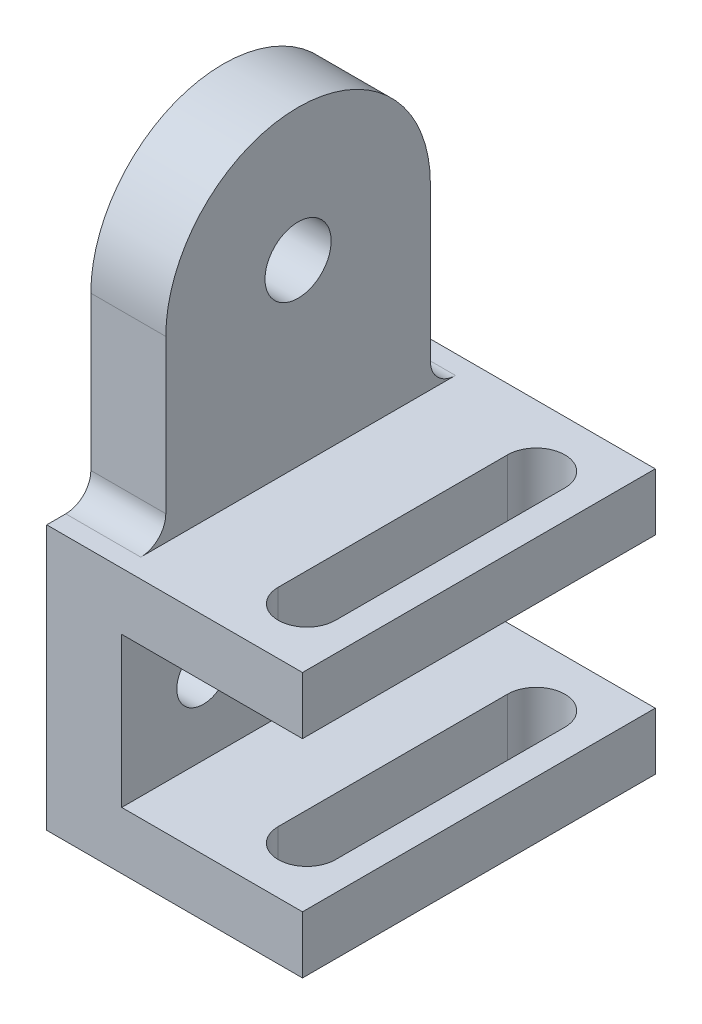
ISO-10303-21;
HEADER;
FILE_DESCRIPTION(('STEP AP214'),'2;1');
FILE_NAME('part.step','',(''),(''),'','','');
FILE_SCHEMA(('AUTOMOTIVE_DESIGN { 1 0 10303 214 1 1 1 1 }'));
ENDSEC;
DATA;
#1=APPLICATION_CONTEXT('core data for automotive mechanical design processes');
#2=APPLICATION_PROTOCOL_DEFINITION('international standard','automotive_design',2000,#1);
#3=PRODUCT_CONTEXT('',#1,'mechanical');
#4=PRODUCT('Part','Part','',(#3));
#5=PRODUCT_RELATED_PRODUCT_CATEGORY('part','',(#4));
#6=PRODUCT_DEFINITION_FORMATION('','',#4);
#7=PRODUCT_DEFINITION_CONTEXT('part definition',#1,'design');
#8=PRODUCT_DEFINITION('design','',#6,#7);
#9=PRODUCT_DEFINITION_SHAPE('','',#8);
#10=(LENGTH_UNIT() NAMED_UNIT(*) SI_UNIT(.MILLI.,.METRE.));
#11=(NAMED_UNIT(*) PLANE_ANGLE_UNIT() SI_UNIT($,.RADIAN.));
#12=(NAMED_UNIT(*) SI_UNIT($,.STERADIAN.) SOLID_ANGLE_UNIT());
#13=UNCERTAINTY_MEASURE_WITH_UNIT(LENGTH_MEASURE(1.E-05),#10,'distance_accuracy_value','');
#14=(GEOMETRIC_REPRESENTATION_CONTEXT(3) GLOBAL_UNCERTAINTY_ASSIGNED_CONTEXT((#13)) GLOBAL_UNIT_ASSIGNED_CONTEXT((#10,
#11,#12)) REPRESENTATION_CONTEXT('',''));
#15=CARTESIAN_POINT('',(0.,0.,0.));
#16=DIRECTION('',(0.,0.,1.));
#17=DIRECTION('',(1.,0.,0.));
#18=AXIS2_PLACEMENT_3D('',#15,#16,#17);
#19=CARTESIAN_POINT('',(29.,-17.,-80.));
#20=DIRECTION('',(1.,0.,0.));
#21=DIRECTION('',(0.,0.,-1.));
#22=AXIS2_PLACEMENT_3D('',#19,#20,#21);
#23=PLANE('',#22);
#24=DIRECTION('',(0.,1.,0.));
#25=VECTOR('',#24,1.);
#26=CARTESIAN_POINT('',(29.,-17.,0.));
#27=LINE('',#26,#25);
#28=CARTESIAN_POINT('',(29.,-30.,0.));
#29=VERTEX_POINT('',#28);
#30=CARTESIAN_POINT('',(29.,-17.,0.));
#31=VERTEX_POINT('',#30);
#32=EDGE_CURVE('E311',#29,#31,#27,.T.);
#33=ORIENTED_EDGE('',*,*,#32,.F.);
#34=DIRECTION('',(0.,0.,1.));
#35=VECTOR('',#34,1.);
#36=CARTESIAN_POINT('',(29.,-30.,-80.));
#37=LINE('',#36,#35);
#38=CARTESIAN_POINT('',(29.,-30.,-80.));
#39=VERTEX_POINT('',#38);
#40=EDGE_CURVE('E391',#39,#29,#37,.T.);
#41=ORIENTED_EDGE('',*,*,#40,.F.);
#42=DIRECTION('',(0.,1.,0.));
#43=VECTOR('',#42,1.);
#44=CARTESIAN_POINT('',(29.,-17.,-80.));
#45=LINE('',#44,#43);
#46=CARTESIAN_POINT('',(29.,-17.,-80.));
#47=VERTEX_POINT('',#46);
#48=EDGE_CURVE('E327',#39,#47,#45,.T.);
#49=ORIENTED_EDGE('',*,*,#48,.T.);
#50=DIRECTION('',(0.,0.,1.));
#51=VECTOR('',#50,1.);
#52=CARTESIAN_POINT('',(29.,-17.,-80.));
#53=LINE('',#52,#51);
#54=EDGE_CURVE('E360',#47,#31,#53,.T.);
#55=ORIENTED_EDGE('',*,*,#54,.T.);
#56=EDGE_LOOP('',(#33,#41,#49,#55));
#57=FACE_BOUND('',#56,.T.);
#58=ADVANCED_FACE('F43',(#57),#23,.T.);
#59=CARTESIAN_POINT('',(-29.,-30.,-80.));
#60=DIRECTION('',(0.,-1.,0.));
#61=DIRECTION('',(0.,0.,-1.));
#62=AXIS2_PLACEMENT_3D('',#59,#60,#61);
#63=PLANE('',#62);
#64=CARTESIAN_POINT('',(16.,-30.,-66.));
#65=DIRECTION('',(0.,-1.,0.));
#66=DIRECTION('',(0.,0.,-1.));
#67=AXIS2_PLACEMENT_3D('',#64,#65,#66);
#68=CIRCLE('',#67,6.5);
#69=CARTESIAN_POINT('',(9.49999999999999,-30.,-66.));
#70=VERTEX_POINT('',#69);
#71=CARTESIAN_POINT('',(22.5,-30.,-66.));
#72=VERTEX_POINT('',#71);
#73=EDGE_CURVE('E254',#70,#72,#68,.T.);
#74=ORIENTED_EDGE('',*,*,#73,.F.);
#75=DIRECTION('',(0.,0.,-1.));
#76=VECTOR('',#75,1.);
#77=CARTESIAN_POINT('',(9.49999999999999,-30.,-80.));
#78=LINE('',#77,#76);
#79=CARTESIAN_POINT('',(9.5,-30.,-14.));
#80=VERTEX_POINT('',#79);
#81=EDGE_CURVE('E237',#80,#70,#78,.T.);
#82=ORIENTED_EDGE('',*,*,#81,.F.);
#83=CARTESIAN_POINT('',(16.,-30.,-14.));
#84=DIRECTION('',(0.,-1.,0.));
#85=DIRECTION('',(0.,0.,-1.));
#86=AXIS2_PLACEMENT_3D('',#83,#84,#85);
#87=CIRCLE('',#86,6.5);
#88=CARTESIAN_POINT('',(22.5,-30.,-14.));
#89=VERTEX_POINT('',#88);
#90=EDGE_CURVE('E242',#89,#80,#87,.T.);
#91=ORIENTED_EDGE('',*,*,#90,.F.);
#92=DIRECTION('',(0.,0.,1.));
#93=VECTOR('',#92,1.);
#94=CARTESIAN_POINT('',(22.5,-30.,-80.));
#95=LINE('',#94,#93);
#96=EDGE_CURVE('E248',#72,#89,#95,.T.);
#97=ORIENTED_EDGE('',*,*,#96,.F.);
#98=EDGE_LOOP('',(#74,#82,#91,#97));
#99=FACE_BOUND('',#98,.T.);
#100=DIRECTION('',(1.,0.,0.));
#101=VECTOR('',#100,1.);
#102=CARTESIAN_POINT('',(-29.,-30.,0.));
#103=LINE('',#102,#101);
#104=CARTESIAN_POINT('',(-29.,-30.,0.));
#105=VERTEX_POINT('',#104);
#106=EDGE_CURVE('E332',#105,#29,#103,.T.);
#107=ORIENTED_EDGE('',*,*,#106,.F.);
#108=DIRECTION('',(0.,0.,1.));
#109=VECTOR('',#108,1.);
#110=CARTESIAN_POINT('',(-29.,-30.,-80.));
#111=LINE('',#110,#109);
#112=CARTESIAN_POINT('',(-29.,-30.,-80.));
#113=VERTEX_POINT('',#112);
#114=EDGE_CURVE('E395',#113,#105,#111,.T.);
#115=ORIENTED_EDGE('',*,*,#114,.F.);
#116=DIRECTION('',(1.,0.,0.));
#117=VECTOR('',#116,1.);
#118=CARTESIAN_POINT('',(-29.,-30.,-80.));
#119=LINE('',#118,#117);
#120=EDGE_CURVE('E356',#113,#39,#119,.T.);
#121=ORIENTED_EDGE('',*,*,#120,.T.);
#122=ORIENTED_EDGE('',*,*,#40,.T.);
#123=EDGE_LOOP('',(#107,#115,#121,#122));
#124=FACE_BOUND('',#123,.T.);
#125=ADVANCED_FACE('F506',(#99,#124),#63,.T.);
#126=CARTESIAN_POINT('',(-29.,30.,-80.));
#127=DIRECTION('',(-1.,0.,0.));
#128=DIRECTION('',(0.,-1.,0.));
#129=AXIS2_PLACEMENT_3D('',#126,#127,#128);
#130=PLANE('',#129);
#131=CARTESIAN_POINT('',(-29.,0.,-18.5));
#132=DIRECTION('',(-1.,0.,0.));
#133=DIRECTION('',(0.,-1.,0.));
#134=AXIS2_PLACEMENT_3D('',#131,#132,#133);
#135=CIRCLE('',#134,6.);
#136=CARTESIAN_POINT('',(-29.,-6.,-18.5));
#137=VERTEX_POINT('',#136);
#138=EDGE_CURVE('E790',#137,#137,#135,.T.);
#139=ORIENTED_EDGE('',*,*,#138,.F.);
#140=EDGE_LOOP('',(#139));
#141=FACE_BOUND('',#140,.T.);
#142=CARTESIAN_POINT('',(-29.,0.,-61.5));
#143=DIRECTION('',(-1.,0.,0.));
#144=DIRECTION('',(0.,-1.,0.));
#145=AXIS2_PLACEMENT_3D('',#142,#143,#144);
#146=CIRCLE('',#145,6.);
#147=CARTESIAN_POINT('',(-29.,-6.00000000000001,-61.5));
#148=VERTEX_POINT('',#147);
#149=EDGE_CURVE('E795',#148,#148,#146,.T.);
#150=ORIENTED_EDGE('',*,*,#149,.F.);
#151=EDGE_LOOP('',(#150));
#152=FACE_BOUND('',#151,.T.);
#153=CARTESIAN_POINT('',(-29.,70.5,-40.));
#154=DIRECTION('',(-1.,0.,0.));
#155=DIRECTION('',(0.,-1.,0.));
#156=AXIS2_PLACEMENT_3D('',#153,#154,#155);
#157=CIRCLE('',#156,7.5);
#158=CARTESIAN_POINT('',(-29.,63.,-40.));
#159=VERTEX_POINT('',#158);
#160=EDGE_CURVE('E257',#159,#159,#157,.T.);
#161=ORIENTED_EDGE('',*,*,#160,.F.);
#162=EDGE_LOOP('',(#161));
#163=FACE_BOUND('',#162,.T.);
#164=DIRECTION('',(0.,-1.,0.));
#165=VECTOR('',#164,1.);
#166=CARTESIAN_POINT('',(-29.,30.,0.));
#167=LINE('',#166,#165);
#168=CARTESIAN_POINT('',(-29.,30.,0.));
#169=VERTEX_POINT('',#168);
#170=EDGE_CURVE('E384',#169,#105,#167,.T.);
#171=ORIENTED_EDGE('',*,*,#170,.F.);
#172=DIRECTION('',(0.,0.,1.));
#173=VECTOR('',#172,1.);
#174=CARTESIAN_POINT('',(-29.,30.,-80.));
#175=LINE('',#174,#173);
#176=CARTESIAN_POINT('',(-29.,30.,-4.31606843045706));
#177=VERTEX_POINT('',#176);
#178=EDGE_CURVE('E401',#177,#169,#175,.T.);
#179=ORIENTED_EDGE('',*,*,#178,.F.);
#180=CARTESIAN_POINT('',(-29.,35.6839315695429,-4.31606843045711));
#181=DIRECTION('',(1.,0.,0.));
#182=DIRECTION('',(0.,1.,0.));
#183=AXIS2_PLACEMENT_3D('',#180,#181,#182);
#184=CIRCLE('',#183,5.68393156954289);
#185=CARTESIAN_POINT('',(-29.,35.6839315695429,-10.));
#186=VERTEX_POINT('',#185);
#187=EDGE_CURVE('E262',#177,#186,#184,.T.);
#188=ORIENTED_EDGE('',*,*,#187,.T.);
#189=DIRECTION('',(0.,-1.,0.));
#190=VECTOR('',#189,1.);
#191=CARTESIAN_POINT('',(-29.,70.5,-10.));
#192=LINE('',#191,#190);
#193=CARTESIAN_POINT('',(-29.,70.5,-10.));
#194=VERTEX_POINT('',#193);
#195=EDGE_CURVE('E292',#194,#186,#192,.T.);
#196=ORIENTED_EDGE('',*,*,#195,.F.);
#197=CARTESIAN_POINT('',(-29.,70.5,-40.));
#198=DIRECTION('',(-1.,0.,0.));
#199=DIRECTION('',(0.,-1.,0.));
#200=AXIS2_PLACEMENT_3D('',#197,#198,#199);
#201=CIRCLE('',#200,30.);
#202=CARTESIAN_POINT('',(-29.,70.5,-70.));
#203=VERTEX_POINT('',#202);
#204=EDGE_CURVE('E296',#194,#203,#201,.T.);
#205=ORIENTED_EDGE('',*,*,#204,.T.);
#206=DIRECTION('',(0.,-1.,0.));
#207=VECTOR('',#206,1.);
#208=CARTESIAN_POINT('',(-29.,70.5,-70.));
#209=LINE('',#208,#207);
#210=CARTESIAN_POINT('',(-29.,35.6839315695429,-70.));
#211=VERTEX_POINT('',#210);
#212=EDGE_CURVE('E300',#203,#211,#209,.T.);
#213=ORIENTED_EDGE('',*,*,#212,.T.);
#214=CARTESIAN_POINT('',(-29.,35.6839315695429,-75.6839315695429));
#215=DIRECTION('',(-1.,0.,0.));
#216=DIRECTION('',(0.,-1.,0.));
#217=AXIS2_PLACEMENT_3D('',#214,#215,#216);
#218=CIRCLE('',#217,5.68393156954289);
#219=CARTESIAN_POINT('',(-29.,30.,-75.6839315695429));
#220=VERTEX_POINT('',#219);
#221=EDGE_CURVE('E271',#220,#211,#218,.T.);
#222=ORIENTED_EDGE('',*,*,#221,.F.);
#223=CARTESIAN_POINT('',(-29.,30.,-80.));
#224=VERTEX_POINT('',#223);
#225=EDGE_CURVE('E398',#224,#220,#175,.T.);
#226=ORIENTED_EDGE('',*,*,#225,.F.);
#227=DIRECTION('',(0.,-1.,0.));
#228=VECTOR('',#227,1.);
#229=CARTESIAN_POINT('',(-29.,30.,-80.));
#230=LINE('',#229,#228);
#231=EDGE_CURVE('E352',#224,#113,#230,.T.);
#232=ORIENTED_EDGE('',*,*,#231,.T.);
#233=ORIENTED_EDGE('',*,*,#114,.T.);
#234=EDGE_LOOP('',(#171,#179,#188,#196,#205,#213,#222,#226,#232,#233));
#235=FACE_BOUND('',#234,.T.);
#236=ADVANCED_FACE('F454',(#141,#152,#163,#235),#130,.T.);
#237=CARTESIAN_POINT('',(-29.,30.,-80.));
#238=DIRECTION('',(0.,1.,0.));
#239=DIRECTION('',(0.,0.,1.));
#240=AXIS2_PLACEMENT_3D('',#237,#238,#239);
#241=PLANE('',#240);
#242=CARTESIAN_POINT('',(16.,30.,-66.));
#243=DIRECTION('',(0.,1.,0.));
#244=DIRECTION('',(0.,0.,1.));
#245=AXIS2_PLACEMENT_3D('',#242,#243,#244);
#246=CIRCLE('',#245,6.5);
#247=CARTESIAN_POINT('',(22.5,30.,-66.));
#248=VERTEX_POINT('',#247);
#249=CARTESIAN_POINT('',(9.5,30.,-66.));
#250=VERTEX_POINT('',#249);
#251=EDGE_CURVE('E66',#248,#250,#246,.T.);
#252=ORIENTED_EDGE('',*,*,#251,.F.);
#253=DIRECTION('',(0.,0.,-1.));
#254=VECTOR('',#253,1.);
#255=CARTESIAN_POINT('',(22.5,30.,-66.));
#256=LINE('',#255,#254);
#257=CARTESIAN_POINT('',(22.5,30.,-14.));
#258=VERTEX_POINT('',#257);
#259=EDGE_CURVE('E217',#258,#248,#256,.T.);
#260=ORIENTED_EDGE('',*,*,#259,.F.);
#261=CARTESIAN_POINT('',(16.,30.,-14.));
#262=DIRECTION('',(0.,1.,0.));
#263=DIRECTION('',(0.,0.,1.));
#264=AXIS2_PLACEMENT_3D('',#261,#262,#263);
#265=CIRCLE('',#264,6.5);
#266=CARTESIAN_POINT('',(9.5,30.,-14.));
#267=VERTEX_POINT('',#266);
#268=EDGE_CURVE('E198',#267,#258,#265,.T.);
#269=ORIENTED_EDGE('',*,*,#268,.F.);
#270=DIRECTION('',(0.,0.,1.));
#271=VECTOR('',#270,1.);
#272=CARTESIAN_POINT('',(9.49999999999999,30.,-66.));
#273=LINE('',#272,#271);
#274=EDGE_CURVE('E208',#250,#267,#273,.T.);
#275=ORIENTED_EDGE('',*,*,#274,.F.);
#276=EDGE_LOOP('',(#252,#260,#269,#275));
#277=FACE_BOUND('',#276,.T.);
#278=DIRECTION('',(-1.,0.,0.));
#279=VECTOR('',#278,1.);
#280=CARTESIAN_POINT('',(-12.,30.,-4.31606843045706));
#281=LINE('',#280,#279);
#282=CARTESIAN_POINT('',(-12.,30.,-4.31606843045707));
#283=VERTEX_POINT('',#282);
#284=EDGE_CURVE('E307',#283,#177,#281,.T.);
#285=ORIENTED_EDGE('',*,*,#284,.T.);
#286=ORIENTED_EDGE('',*,*,#178,.T.);
#287=DIRECTION('',(-1.,0.,0.));
#288=VECTOR('',#287,1.);
#289=CARTESIAN_POINT('',(-29.,30.,0.));
#290=LINE('',#289,#288);
#291=CARTESIAN_POINT('',(29.,30.,0.));
#292=VERTEX_POINT('',#291);
#293=EDGE_CURVE('E380',#292,#169,#290,.T.);
#294=ORIENTED_EDGE('',*,*,#293,.F.);
#295=DIRECTION('',(0.,0.,1.));
#296=VECTOR('',#295,1.);
#297=CARTESIAN_POINT('',(29.,30.,-80.));
#298=LINE('',#297,#296);
#299=CARTESIAN_POINT('',(29.,30.,-80.));
#300=VERTEX_POINT('',#299);
#301=EDGE_CURVE('E402',#300,#292,#298,.T.);
#302=ORIENTED_EDGE('',*,*,#301,.F.);
#303=DIRECTION('',(-1.,0.,0.));
#304=VECTOR('',#303,1.);
#305=CARTESIAN_POINT('',(-29.,30.,-80.));
#306=LINE('',#305,#304);
#307=EDGE_CURVE('E348',#300,#224,#306,.T.);
#308=ORIENTED_EDGE('',*,*,#307,.T.);
#309=ORIENTED_EDGE('',*,*,#225,.T.);
#310=DIRECTION('',(-1.,0.,0.));
#311=VECTOR('',#310,1.);
#312=CARTESIAN_POINT('',(-12.,30.,-75.6839315695429));
#313=LINE('',#312,#311);
#314=CARTESIAN_POINT('',(-12.,30.,-75.6839315695429));
#315=VERTEX_POINT('',#314);
#316=EDGE_CURVE('E312',#315,#220,#313,.T.);
#317=ORIENTED_EDGE('',*,*,#316,.F.);
#318=DIRECTION('',(0.,0.,1.));
#319=VECTOR('',#318,1.);
#320=CARTESIAN_POINT('',(-12.,30.,-75.6839315695429));
#321=LINE('',#320,#319);
#322=EDGE_CURVE('E285',#315,#283,#321,.T.);
#323=ORIENTED_EDGE('',*,*,#322,.T.);
#324=EDGE_LOOP('',(#285,#286,#294,#302,#308,#309,#317,#323));
#325=FACE_BOUND('',#324,.T.);
#326=ADVANCED_FACE('F214',(#277,#325),#241,.T.);
#327=CARTESIAN_POINT('',(29.,30.,-80.));
#328=DIRECTION('',(1.,0.,0.));
#329=DIRECTION('',(0.,1.,0.));
#330=AXIS2_PLACEMENT_3D('',#327,#328,#329);
#331=PLANE('',#330);
#332=DIRECTION('',(0.,1.,0.));
#333=VECTOR('',#332,1.);
#334=CARTESIAN_POINT('',(29.,30.,0.));
#335=LINE('',#334,#333);
#336=CARTESIAN_POINT('',(29.,17.,0.));
#337=VERTEX_POINT('',#336);
#338=EDGE_CURVE('E376',#337,#292,#335,.T.);
#339=ORIENTED_EDGE('',*,*,#338,.F.);
#340=DIRECTION('',(0.,0.,1.));
#341=VECTOR('',#340,1.);
#342=CARTESIAN_POINT('',(29.,17.,-80.));
#343=LINE('',#342,#341);
#344=CARTESIAN_POINT('',(29.,17.,-80.));
#345=VERTEX_POINT('',#344);
#346=EDGE_CURVE('E405',#345,#337,#343,.T.);
#347=ORIENTED_EDGE('',*,*,#346,.F.);
#348=DIRECTION('',(0.,1.,0.));
#349=VECTOR('',#348,1.);
#350=CARTESIAN_POINT('',(29.,30.,-80.));
#351=LINE('',#350,#349);
#352=EDGE_CURVE('E344',#345,#300,#351,.T.);
#353=ORIENTED_EDGE('',*,*,#352,.T.);
#354=ORIENTED_EDGE('',*,*,#301,.T.);
#355=EDGE_LOOP('',(#339,#347,#353,#354));
#356=FACE_BOUND('',#355,.T.);
#357=ADVANCED_FACE('F461',(#356),#331,.T.);
#358=CARTESIAN_POINT('',(-12.,17.,-80.));
#359=DIRECTION('',(0.,-1.,0.));
#360=DIRECTION('',(0.,0.,-1.));
#361=AXIS2_PLACEMENT_3D('',#358,#359,#360);
#362=PLANE('',#361);
#363=CARTESIAN_POINT('',(16.,17.,-66.));
#364=DIRECTION('',(0.,-1.,0.));
#365=DIRECTION('',(0.,0.,-1.));
#366=AXIS2_PLACEMENT_3D('',#363,#364,#365);
#367=CIRCLE('',#366,6.5);
#368=CARTESIAN_POINT('',(9.49999999999999,17.,-66.));
#369=VERTEX_POINT('',#368);
#370=CARTESIAN_POINT('',(22.5,17.,-66.));
#371=VERTEX_POINT('',#370);
#372=EDGE_CURVE('E251',#369,#371,#367,.T.);
#373=ORIENTED_EDGE('',*,*,#372,.F.);
#374=DIRECTION('',(0.,0.,-1.));
#375=VECTOR('',#374,1.);
#376=CARTESIAN_POINT('',(9.49999999999999,17.,-80.));
#377=LINE('',#376,#375);
#378=CARTESIAN_POINT('',(9.5,17.,-14.));
#379=VERTEX_POINT('',#378);
#380=EDGE_CURVE('E234',#379,#369,#377,.T.);
#381=ORIENTED_EDGE('',*,*,#380,.F.);
#382=CARTESIAN_POINT('',(16.,17.,-14.));
#383=DIRECTION('',(0.,-1.,0.));
#384=DIRECTION('',(0.,0.,-1.));
#385=AXIS2_PLACEMENT_3D('',#382,#383,#384);
#386=CIRCLE('',#385,6.5);
#387=CARTESIAN_POINT('',(22.5,17.,-14.));
#388=VERTEX_POINT('',#387);
#389=EDGE_CURVE('E201',#388,#379,#386,.T.);
#390=ORIENTED_EDGE('',*,*,#389,.F.);
#391=DIRECTION('',(0.,0.,1.));
#392=VECTOR('',#391,1.);
#393=CARTESIAN_POINT('',(22.5,17.,-80.));
#394=LINE('',#393,#392);
#395=EDGE_CURVE('E245',#371,#388,#394,.T.);
#396=ORIENTED_EDGE('',*,*,#395,.F.);
#397=EDGE_LOOP('',(#373,#381,#390,#396));
#398=FACE_BOUND('',#397,.T.);
#399=DIRECTION('',(1.,0.,0.));
#400=VECTOR('',#399,1.);
#401=CARTESIAN_POINT('',(-12.,17.,0.));
#402=LINE('',#401,#400);
#403=CARTESIAN_POINT('',(-12.,17.,0.));
#404=VERTEX_POINT('',#403);
#405=EDGE_CURVE('E372',#404,#337,#402,.T.);
#406=ORIENTED_EDGE('',*,*,#405,.F.);
#407=DIRECTION('',(0.,0.,1.));
#408=VECTOR('',#407,1.);
#409=CARTESIAN_POINT('',(-12.,17.,-80.));
#410=LINE('',#409,#408);
#411=CARTESIAN_POINT('',(-12.,17.,-80.));
#412=VERTEX_POINT('',#411);
#413=EDGE_CURVE('E408',#412,#404,#410,.T.);
#414=ORIENTED_EDGE('',*,*,#413,.F.);
#415=DIRECTION('',(1.,0.,0.));
#416=VECTOR('',#415,1.);
#417=CARTESIAN_POINT('',(-12.,17.,-80.));
#418=LINE('',#417,#416);
#419=EDGE_CURVE('E340',#412,#345,#418,.T.);
#420=ORIENTED_EDGE('',*,*,#419,.T.);
#421=ORIENTED_EDGE('',*,*,#346,.T.);
#422=EDGE_LOOP('',(#406,#414,#420,#421));
#423=FACE_BOUND('',#422,.T.);
#424=ADVANCED_FACE('F522',(#398,#423),#362,.T.);
#425=CARTESIAN_POINT('',(-12.,17.,-80.));
#426=DIRECTION('',(1.,0.,0.));
#427=DIRECTION('',(0.,1.,0.));
#428=AXIS2_PLACEMENT_3D('',#425,#426,#427);
#429=PLANE('',#428);
#430=CARTESIAN_POINT('',(-12.,0.,-18.5));
#431=DIRECTION('',(1.,0.,0.));
#432=DIRECTION('',(0.,1.,0.));
#433=AXIS2_PLACEMENT_3D('',#430,#431,#432);
#434=CIRCLE('',#433,6.);
#435=CARTESIAN_POINT('',(-12.,6.,-18.5));
#436=VERTEX_POINT('',#435);
#437=EDGE_CURVE('E793',#436,#436,#434,.T.);
#438=ORIENTED_EDGE('',*,*,#437,.F.);
#439=EDGE_LOOP('',(#438));
#440=FACE_BOUND('',#439,.T.);
#441=CARTESIAN_POINT('',(-12.,0.,-61.5));
#442=DIRECTION('',(1.,0.,0.));
#443=DIRECTION('',(0.,1.,0.));
#444=AXIS2_PLACEMENT_3D('',#441,#442,#443);
#445=CIRCLE('',#444,6.);
#446=CARTESIAN_POINT('',(-12.,6.,-61.5));
#447=VERTEX_POINT('',#446);
#448=EDGE_CURVE('E796',#447,#447,#445,.T.);
#449=ORIENTED_EDGE('',*,*,#448,.F.);
#450=EDGE_LOOP('',(#449));
#451=FACE_BOUND('',#450,.T.);
#452=DIRECTION('',(0.,1.,0.));
#453=VECTOR('',#452,1.);
#454=CARTESIAN_POINT('',(-12.,17.,0.));
#455=LINE('',#454,#453);
#456=CARTESIAN_POINT('',(-12.,-17.,0.));
#457=VERTEX_POINT('',#456);
#458=EDGE_CURVE('E368',#457,#404,#455,.T.);
#459=ORIENTED_EDGE('',*,*,#458,.F.);
#460=DIRECTION('',(0.,0.,1.));
#461=VECTOR('',#460,1.);
#462=CARTESIAN_POINT('',(-12.,-17.,-80.));
#463=LINE('',#462,#461);
#464=CARTESIAN_POINT('',(-12.,-17.,-80.));
#465=VERTEX_POINT('',#464);
#466=EDGE_CURVE('E411',#465,#457,#463,.T.);
#467=ORIENTED_EDGE('',*,*,#466,.F.);
#468=DIRECTION('',(0.,1.,0.));
#469=VECTOR('',#468,1.);
#470=CARTESIAN_POINT('',(-12.,17.,-80.));
#471=LINE('',#470,#469);
#472=EDGE_CURVE('E336',#465,#412,#471,.T.);
#473=ORIENTED_EDGE('',*,*,#472,.T.);
#474=ORIENTED_EDGE('',*,*,#413,.T.);
#475=EDGE_LOOP('',(#459,#467,#473,#474));
#476=FACE_BOUND('',#475,.T.);
#477=ADVANCED_FACE('F520',(#440,#451,#476),#429,.T.);
#478=CARTESIAN_POINT('',(-12.,-17.,-80.));
#479=DIRECTION('',(0.,1.,0.));
#480=DIRECTION('',(0.,0.,1.));
#481=AXIS2_PLACEMENT_3D('',#478,#479,#480);
#482=PLANE('',#481);
#483=CARTESIAN_POINT('',(16.,-17.,-66.));
#484=DIRECTION('',(0.,1.,0.));
#485=DIRECTION('',(0.,0.,1.));
#486=AXIS2_PLACEMENT_3D('',#483,#484,#485);
#487=CIRCLE('',#486,6.5);
#488=CARTESIAN_POINT('',(22.5,-17.,-66.));
#489=VERTEX_POINT('',#488);
#490=CARTESIAN_POINT('',(9.49999999999999,-17.,-66.));
#491=VERTEX_POINT('',#490);
#492=EDGE_CURVE('E11',#489,#491,#487,.T.);
#493=ORIENTED_EDGE('',*,*,#492,.F.);
#494=DIRECTION('',(0.,0.,-1.));
#495=VECTOR('',#494,1.);
#496=CARTESIAN_POINT('',(22.5,-17.,-80.));
#497=LINE('',#496,#495);
#498=CARTESIAN_POINT('',(22.5,-17.,-14.));
#499=VERTEX_POINT('',#498);
#500=EDGE_CURVE('E51',#499,#489,#497,.T.);
#501=ORIENTED_EDGE('',*,*,#500,.F.);
#502=CARTESIAN_POINT('',(16.,-17.,-14.));
#503=DIRECTION('',(0.,1.,0.));
#504=DIRECTION('',(0.,0.,1.));
#505=AXIS2_PLACEMENT_3D('',#502,#503,#504);
#506=CIRCLE('',#505,6.5);
#507=CARTESIAN_POINT('',(9.5,-17.,-14.));
#508=VERTEX_POINT('',#507);
#509=EDGE_CURVE('E418',#508,#499,#506,.T.);
#510=ORIENTED_EDGE('',*,*,#509,.F.);
#511=DIRECTION('',(0.,0.,1.));
#512=VECTOR('',#511,1.);
#513=CARTESIAN_POINT('',(9.49999999999999,-17.,-80.));
#514=LINE('',#513,#512);
#515=EDGE_CURVE('E394',#491,#508,#514,.T.);
#516=ORIENTED_EDGE('',*,*,#515,.F.);
#517=EDGE_LOOP('',(#493,#501,#510,#516));
#518=FACE_BOUND('',#517,.T.);
#519=DIRECTION('',(-1.,0.,0.));
#520=VECTOR('',#519,1.);
#521=CARTESIAN_POINT('',(-12.,-17.,0.));
#522=LINE('',#521,#520);
#523=EDGE_CURVE('E364',#31,#457,#522,.T.);
#524=ORIENTED_EDGE('',*,*,#523,.F.);
#525=ORIENTED_EDGE('',*,*,#54,.F.);
#526=DIRECTION('',(-1.,0.,0.));
#527=VECTOR('',#526,1.);
#528=CARTESIAN_POINT('',(-12.,-17.,-80.));
#529=LINE('',#528,#527);
#530=EDGE_CURVE('E331',#47,#465,#529,.T.);
#531=ORIENTED_EDGE('',*,*,#530,.T.);
#532=ORIENTED_EDGE('',*,*,#466,.T.);
#533=EDGE_LOOP('',(#524,#525,#531,#532));
#534=FACE_BOUND('',#533,.T.);
#535=ADVANCED_FACE('F438',(#518,#534),#482,.T.);
#536=CARTESIAN_POINT('',(0.,0.,-80.));
#537=DIRECTION('',(0.,0.,1.));
#538=DIRECTION('',(1.,0.,0.));
#539=AXIS2_PLACEMENT_3D('',#536,#537,#538);
#540=PLANE('',#539);
#541=ORIENTED_EDGE('',*,*,#48,.F.);
#542=ORIENTED_EDGE('',*,*,#120,.F.);
#543=ORIENTED_EDGE('',*,*,#231,.F.);
#544=ORIENTED_EDGE('',*,*,#307,.F.);
#545=ORIENTED_EDGE('',*,*,#352,.F.);
#546=ORIENTED_EDGE('',*,*,#419,.F.);
#547=ORIENTED_EDGE('',*,*,#472,.F.);
#548=ORIENTED_EDGE('',*,*,#530,.F.);
#549=EDGE_LOOP('',(#541,#542,#543,#544,#545,#546,#547,#548));
#550=FACE_BOUND('',#549,.T.);
#551=ADVANCED_FACE('F467',(#550),#540,.F.);
#552=CARTESIAN_POINT('',(0.,0.,0.));
#553=DIRECTION('',(0.,0.,1.));
#554=DIRECTION('',(1.,0.,0.));
#555=AXIS2_PLACEMENT_3D('',#552,#553,#554);
#556=PLANE('',#555);
#557=ORIENTED_EDGE('',*,*,#32,.T.);
#558=ORIENTED_EDGE('',*,*,#523,.T.);
#559=ORIENTED_EDGE('',*,*,#458,.T.);
#560=ORIENTED_EDGE('',*,*,#405,.T.);
#561=ORIENTED_EDGE('',*,*,#338,.T.);
#562=ORIENTED_EDGE('',*,*,#293,.T.);
#563=ORIENTED_EDGE('',*,*,#170,.T.);
#564=ORIENTED_EDGE('',*,*,#106,.T.);
#565=EDGE_LOOP('',(#557,#558,#559,#560,#561,#562,#563,#564));
#566=FACE_BOUND('',#565,.T.);
#567=ADVANCED_FACE('F457',(#566),#556,.T.);
#568=CARTESIAN_POINT('',(-12.,35.6839315695429,-4.31606843045711));
#569=DIRECTION('',(-1.,0.,0.));
#570=DIRECTION('',(0.,-1.,0.));
#571=AXIS2_PLACEMENT_3D('',#568,#569,#570);
#572=CYLINDRICAL_SURFACE('',#571,5.68393156954289);
#573=ORIENTED_EDGE('',*,*,#187,.F.);
#574=ORIENTED_EDGE('',*,*,#284,.F.);
#575=CARTESIAN_POINT('',(-12.,35.6839315695429,-4.31606843045711));
#576=DIRECTION('',(1.,0.,0.));
#577=DIRECTION('',(0.,1.,0.));
#578=AXIS2_PLACEMENT_3D('',#575,#576,#577);
#579=CIRCLE('',#578,5.68393156954289);
#580=CARTESIAN_POINT('',(-12.,35.6839315695429,-10.));
#581=VERTEX_POINT('',#580);
#582=EDGE_CURVE('E266',#283,#581,#579,.T.);
#583=ORIENTED_EDGE('',*,*,#582,.T.);
#584=DIRECTION('',(-1.,0.,0.));
#585=VECTOR('',#584,1.);
#586=CARTESIAN_POINT('',(-12.,35.6839315695429,-10.));
#587=LINE('',#586,#585);
#588=EDGE_CURVE('E288',#581,#186,#587,.T.);
#589=ORIENTED_EDGE('',*,*,#588,.T.);
#590=EDGE_LOOP('',(#573,#574,#583,#589));
#591=FACE_BOUND('',#590,.T.);
#592=ADVANCED_FACE('F481',(#591),#572,.F.);
#593=CARTESIAN_POINT('',(-12.,35.6839315695429,-75.6839315695429));
#594=DIRECTION('',(-1.,0.,0.));
#595=DIRECTION('',(0.,-1.,0.));
#596=AXIS2_PLACEMENT_3D('',#593,#594,#595);
#597=CYLINDRICAL_SURFACE('',#596,5.68393156954289);
#598=ORIENTED_EDGE('',*,*,#221,.T.);
#599=DIRECTION('',(-1.,0.,0.));
#600=VECTOR('',#599,1.);
#601=CARTESIAN_POINT('',(-12.,35.6839315695429,-70.));
#602=LINE('',#601,#600);
#603=CARTESIAN_POINT('',(-12.,35.6839315695429,-70.));
#604=VERTEX_POINT('',#603);
#605=EDGE_CURVE('E316',#604,#211,#602,.T.);
#606=ORIENTED_EDGE('',*,*,#605,.F.);
#607=CARTESIAN_POINT('',(-12.,35.6839315695429,-75.6839315695429));
#608=DIRECTION('',(-1.,0.,0.));
#609=DIRECTION('',(0.,-1.,0.));
#610=AXIS2_PLACEMENT_3D('',#607,#608,#609);
#611=CIRCLE('',#610,5.68393156954289);
#612=EDGE_CURVE('E282',#315,#604,#611,.T.);
#613=ORIENTED_EDGE('',*,*,#612,.F.);
#614=ORIENTED_EDGE('',*,*,#316,.T.);
#615=EDGE_LOOP('',(#598,#606,#613,#614));
#616=FACE_BOUND('',#615,.T.);
#617=ADVANCED_FACE('F473',(#616),#597,.F.);
#618=CARTESIAN_POINT('',(-12.,70.5,-70.));
#619=DIRECTION('',(0.,0.,-1.));
#620=DIRECTION('',(-1.,0.,0.));
#621=AXIS2_PLACEMENT_3D('',#618,#619,#620);
#622=PLANE('',#621);
#623=ORIENTED_EDGE('',*,*,#212,.F.);
#624=DIRECTION('',(-1.,0.,0.));
#625=VECTOR('',#624,1.);
#626=CARTESIAN_POINT('',(-12.,70.5,-70.));
#627=LINE('',#626,#625);
#628=CARTESIAN_POINT('',(-12.,70.5,-70.));
#629=VERTEX_POINT('',#628);
#630=EDGE_CURVE('E319',#629,#203,#627,.T.);
#631=ORIENTED_EDGE('',*,*,#630,.F.);
#632=DIRECTION('',(0.,-1.,0.));
#633=VECTOR('',#632,1.);
#634=CARTESIAN_POINT('',(-12.,70.5,-70.));
#635=LINE('',#634,#633);
#636=EDGE_CURVE('E278',#629,#604,#635,.T.);
#637=ORIENTED_EDGE('',*,*,#636,.T.);
#638=ORIENTED_EDGE('',*,*,#605,.T.);
#639=EDGE_LOOP('',(#623,#631,#637,#638));
#640=FACE_BOUND('',#639,.T.);
#641=ADVANCED_FACE('F492',(#640),#622,.T.);
#642=CARTESIAN_POINT('',(-12.,70.5,-40.));
#643=DIRECTION('',(-1.,0.,0.));
#644=DIRECTION('',(0.,-1.,0.));
#645=AXIS2_PLACEMENT_3D('',#642,#643,#644);
#646=CYLINDRICAL_SURFACE('',#645,30.);
#647=ORIENTED_EDGE('',*,*,#204,.F.);
#648=DIRECTION('',(-1.,0.,0.));
#649=VECTOR('',#648,1.);
#650=CARTESIAN_POINT('',(-12.,70.5,-10.));
#651=LINE('',#650,#649);
#652=CARTESIAN_POINT('',(-12.,70.5,-10.));
#653=VERTEX_POINT('',#652);
#654=EDGE_CURVE('E322',#653,#194,#651,.T.);
#655=ORIENTED_EDGE('',*,*,#654,.F.);
#656=CARTESIAN_POINT('',(-12.,70.5,-40.));
#657=DIRECTION('',(-1.,0.,0.));
#658=DIRECTION('',(0.,-1.,0.));
#659=AXIS2_PLACEMENT_3D('',#656,#657,#658);
#660=CIRCLE('',#659,30.);
#661=EDGE_CURVE('E274',#653,#629,#660,.T.);
#662=ORIENTED_EDGE('',*,*,#661,.T.);
#663=ORIENTED_EDGE('',*,*,#630,.T.);
#664=EDGE_LOOP('',(#647,#655,#662,#663));
#665=FACE_BOUND('',#664,.T.);
#666=ADVANCED_FACE('F487',(#665),#646,.T.);
#667=CARTESIAN_POINT('',(-12.,70.5,-10.));
#668=DIRECTION('',(0.,0.,-1.));
#669=DIRECTION('',(0.,1.,0.));
#670=AXIS2_PLACEMENT_3D('',#667,#668,#669);
#671=PLANE('',#670);
#672=ORIENTED_EDGE('',*,*,#195,.T.);
#673=ORIENTED_EDGE('',*,*,#588,.F.);
#674=DIRECTION('',(0.,-1.,0.));
#675=VECTOR('',#674,1.);
#676=CARTESIAN_POINT('',(-12.,70.5,-10.));
#677=LINE('',#676,#675);
#678=EDGE_CURVE('E270',#653,#581,#677,.T.);
#679=ORIENTED_EDGE('',*,*,#678,.F.);
#680=ORIENTED_EDGE('',*,*,#654,.T.);
#681=EDGE_LOOP('',(#672,#673,#679,#680));
#682=FACE_BOUND('',#681,.T.);
#683=ADVANCED_FACE('F493',(#682),#671,.F.);
#684=CARTESIAN_POINT('',(-12.,35.6839315695429,-4.31606843045711));
#685=DIRECTION('',(1.,0.,0.));
#686=DIRECTION('',(0.,1.,0.));
#687=AXIS2_PLACEMENT_3D('',#684,#685,#686);
#688=PLANE('',#687);
#689=CARTESIAN_POINT('',(-12.,70.5,-40.));
#690=DIRECTION('',(-1.,0.,0.));
#691=DIRECTION('',(0.,-1.,0.));
#692=AXIS2_PLACEMENT_3D('',#689,#690,#691);
#693=CIRCLE('',#692,7.5);
#694=CARTESIAN_POINT('',(-12.,63.,-40.));
#695=VERTEX_POINT('',#694);
#696=EDGE_CURVE('E258',#695,#695,#693,.T.);
#697=ORIENTED_EDGE('',*,*,#696,.T.);
#698=EDGE_LOOP('',(#697));
#699=FACE_BOUND('',#698,.T.);
#700=ORIENTED_EDGE('',*,*,#582,.F.);
#701=ORIENTED_EDGE('',*,*,#322,.F.);
#702=ORIENTED_EDGE('',*,*,#612,.T.);
#703=ORIENTED_EDGE('',*,*,#636,.F.);
#704=ORIENTED_EDGE('',*,*,#661,.F.);
#705=ORIENTED_EDGE('',*,*,#678,.T.);
#706=EDGE_LOOP('',(#700,#701,#702,#703,#704,#705));
#707=FACE_BOUND('',#706,.T.);
#708=ADVANCED_FACE('F479',(#699,#707),#688,.T.);
#709=CARTESIAN_POINT('',(-12.,70.5,-40.));
#710=DIRECTION('',(-1.,0.,0.));
#711=DIRECTION('',(0.,-1.,0.));
#712=AXIS2_PLACEMENT_3D('',#709,#710,#711);
#713=CYLINDRICAL_SURFACE('',#712,7.5);
#714=ORIENTED_EDGE('',*,*,#696,.F.);
#715=EDGE_LOOP('',(#714));
#716=FACE_BOUND('',#715,.T.);
#717=ORIENTED_EDGE('',*,*,#160,.T.);
#718=EDGE_LOOP('',(#717));
#719=FACE_BOUND('',#718,.T.);
#720=ADVANCED_FACE('F500',(#716,#719),#713,.F.);
#721=CARTESIAN_POINT('',(9.49999999999999,-40.,-66.));
#722=DIRECTION('',(-1.,0.,0.));
#723=DIRECTION('',(0.,0.,1.));
#724=AXIS2_PLACEMENT_3D('',#721,#722,#723);
#725=PLANE('',#724);
#726=ORIENTED_EDGE('',*,*,#81,.T.);
#727=DIRECTION('',(0.,1.,0.));
#728=VECTOR('',#727,1.);
#729=CARTESIAN_POINT('',(9.49999999999999,-40.,-66.));
#730=LINE('',#729,#728);
#731=EDGE_CURVE('E205',#70,#491,#730,.T.);
#732=ORIENTED_EDGE('',*,*,#731,.T.);
#733=ORIENTED_EDGE('',*,*,#515,.T.);
#734=DIRECTION('',(0.,1.,0.));
#735=VECTOR('',#734,1.);
#736=CARTESIAN_POINT('',(9.5,-40.,-14.));
#737=LINE('',#736,#735);
#738=EDGE_CURVE('E58',#80,#508,#737,.T.);
#739=ORIENTED_EDGE('',*,*,#738,.F.);
#740=EDGE_LOOP('',(#726,#732,#733,#739));
#741=FACE_BOUND('',#740,.T.);
#742=ADVANCED_FACE('F440',(#741),#725,.F.);
#743=CARTESIAN_POINT('',(16.,-40.,-14.));
#744=DIRECTION('',(0.,1.,0.));
#745=DIRECTION('',(0.,0.,1.));
#746=AXIS2_PLACEMENT_3D('',#743,#744,#745);
#747=CYLINDRICAL_SURFACE('',#746,6.5);
#748=ORIENTED_EDGE('',*,*,#90,.T.);
#749=ORIENTED_EDGE('',*,*,#738,.T.);
#750=ORIENTED_EDGE('',*,*,#509,.T.);
#751=DIRECTION('',(0.,1.,0.));
#752=VECTOR('',#751,1.);
#753=CARTESIAN_POINT('',(22.5,-40.,-14.));
#754=LINE('',#753,#752);
#755=EDGE_CURVE('E228',#89,#499,#754,.T.);
#756=ORIENTED_EDGE('',*,*,#755,.F.);
#757=EDGE_LOOP('',(#748,#749,#750,#756));
#758=FACE_BOUND('',#757,.T.);
#759=ADVANCED_FACE('F442',(#758),#747,.F.);
#760=CARTESIAN_POINT('',(22.5,-40.,-66.));
#761=DIRECTION('',(1.,0.,0.));
#762=DIRECTION('',(0.,0.,-1.));
#763=AXIS2_PLACEMENT_3D('',#760,#761,#762);
#764=PLANE('',#763);
#765=ORIENTED_EDGE('',*,*,#96,.T.);
#766=ORIENTED_EDGE('',*,*,#755,.T.);
#767=ORIENTED_EDGE('',*,*,#500,.T.);
#768=DIRECTION('',(0.,1.,0.));
#769=VECTOR('',#768,1.);
#770=CARTESIAN_POINT('',(22.5,-40.,-66.));
#771=LINE('',#770,#769);
#772=EDGE_CURVE('E227',#72,#489,#771,.T.);
#773=ORIENTED_EDGE('',*,*,#772,.F.);
#774=EDGE_LOOP('',(#765,#766,#767,#773));
#775=FACE_BOUND('',#774,.T.);
#776=ADVANCED_FACE('F426',(#775),#764,.F.);
#777=CARTESIAN_POINT('',(16.,-40.,-66.));
#778=DIRECTION('',(0.,1.,0.));
#779=DIRECTION('',(0.,0.,1.));
#780=AXIS2_PLACEMENT_3D('',#777,#778,#779);
#781=CYLINDRICAL_SURFACE('',#780,6.5);
#782=ORIENTED_EDGE('',*,*,#73,.T.);
#783=ORIENTED_EDGE('',*,*,#772,.T.);
#784=ORIENTED_EDGE('',*,*,#492,.T.);
#785=ORIENTED_EDGE('',*,*,#731,.F.);
#786=EDGE_LOOP('',(#782,#783,#784,#785));
#787=FACE_BOUND('',#786,.T.);
#788=ADVANCED_FACE('F433',(#787),#781,.F.);
#789=ORIENTED_EDGE('',*,*,#372,.T.);
#790=EDGE_CURVE('E224',#371,#248,#771,.T.);
#791=ORIENTED_EDGE('',*,*,#790,.T.);
#792=ORIENTED_EDGE('',*,*,#251,.T.);
#793=EDGE_CURVE('E210',#369,#250,#730,.T.);
#794=ORIENTED_EDGE('',*,*,#793,.F.);
#795=EDGE_LOOP('',(#789,#791,#792,#794));
#796=FACE_BOUND('',#795,.T.);
#797=ADVANCED_FACE('F709',(#796),#781,.F.);
#798=ORIENTED_EDGE('',*,*,#395,.T.);
#799=EDGE_CURVE('E229',#388,#258,#754,.T.);
#800=ORIENTED_EDGE('',*,*,#799,.T.);
#801=ORIENTED_EDGE('',*,*,#259,.T.);
#802=ORIENTED_EDGE('',*,*,#790,.F.);
#803=EDGE_LOOP('',(#798,#800,#801,#802));
#804=FACE_BOUND('',#803,.T.);
#805=ADVANCED_FACE('F701',(#804),#764,.F.);
#806=ORIENTED_EDGE('',*,*,#389,.T.);
#807=EDGE_CURVE('E193',#379,#267,#737,.T.);
#808=ORIENTED_EDGE('',*,*,#807,.T.);
#809=ORIENTED_EDGE('',*,*,#268,.T.);
#810=ORIENTED_EDGE('',*,*,#799,.F.);
#811=EDGE_LOOP('',(#806,#808,#809,#810));
#812=FACE_BOUND('',#811,.T.);
#813=ADVANCED_FACE('F195',(#812),#747,.F.);
#814=ORIENTED_EDGE('',*,*,#380,.T.);
#815=ORIENTED_EDGE('',*,*,#793,.T.);
#816=ORIENTED_EDGE('',*,*,#274,.T.);
#817=ORIENTED_EDGE('',*,*,#807,.F.);
#818=EDGE_LOOP('',(#814,#815,#816,#817));
#819=FACE_BOUND('',#818,.T.);
#820=ADVANCED_FACE('F209',(#819),#725,.F.);
#821=CARTESIAN_POINT('',(-32.,0.,-61.5));
#822=DIRECTION('',(1.,0.,0.));
#823=DIRECTION('',(0.,1.,0.));
#824=AXIS2_PLACEMENT_3D('',#821,#822,#823);
#825=CYLINDRICAL_SURFACE('',#824,6.);
#826=ORIENTED_EDGE('',*,*,#149,.T.);
#827=EDGE_LOOP('',(#826));
#828=FACE_BOUND('',#827,.T.);
#829=ORIENTED_EDGE('',*,*,#448,.T.);
#830=EDGE_LOOP('',(#829));
#831=FACE_BOUND('',#830,.T.);
#832=ADVANCED_FACE('F740',(#828,#831),#825,.F.);
#833=CARTESIAN_POINT('',(-32.,0.,-18.5));
#834=DIRECTION('',(1.,0.,0.));
#835=DIRECTION('',(0.,1.,0.));
#836=AXIS2_PLACEMENT_3D('',#833,#834,#835);
#837=CYLINDRICAL_SURFACE('',#836,6.);
#838=ORIENTED_EDGE('',*,*,#138,.T.);
#839=EDGE_LOOP('',(#838));
#840=FACE_BOUND('',#839,.T.);
#841=ORIENTED_EDGE('',*,*,#437,.T.);
#842=EDGE_LOOP('',(#841));
#843=FACE_BOUND('',#842,.T.);
#844=ADVANCED_FACE('F748',(#840,#843),#837,.F.);
#845=CLOSED_SHELL('',(#58,#125,#236,#326,#357,#424,#477,#535,#551,#567,#592,#617,#641,#666,#683,
#708,#720,#742,#759,#776,#788,#797,#805,#813,#820,#832,#844));
#846=MANIFOLD_SOLID_BREP('B2',#845);
#847=ADVANCED_BREP_SHAPE_REPRESENTATION('',(#18,#846),#14);
#848=SHAPE_DEFINITION_REPRESENTATION(#9,#847);
ENDSEC;
END-ISO-10303-21;
